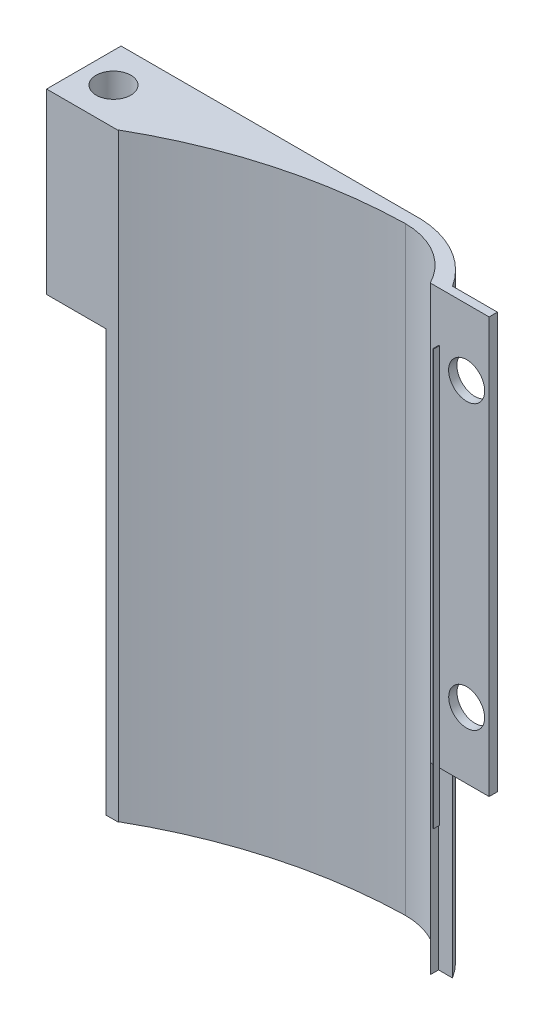
ISO-10303-21;
HEADER;
FILE_DESCRIPTION(('STEP AP214'),'2;1');
FILE_NAME('part.step','',(''),(''),'','','');
FILE_SCHEMA(('AUTOMOTIVE_DESIGN { 1 0 10303 214 1 1 1 1 }'));
ENDSEC;
DATA;
#1=APPLICATION_CONTEXT('core data for automotive mechanical design processes');
#2=APPLICATION_PROTOCOL_DEFINITION('international standard','automotive_design',2000,#1);
#3=PRODUCT_CONTEXT('',#1,'mechanical');
#4=PRODUCT('Part','Part','',(#3));
#5=PRODUCT_RELATED_PRODUCT_CATEGORY('part','',(#4));
#6=PRODUCT_DEFINITION_FORMATION('','',#4);
#7=PRODUCT_DEFINITION_CONTEXT('part definition',#1,'design');
#8=PRODUCT_DEFINITION('design','',#6,#7);
#9=PRODUCT_DEFINITION_SHAPE('','',#8);
#10=(LENGTH_UNIT() NAMED_UNIT(*) SI_UNIT(.MILLI.,.METRE.));
#11=(NAMED_UNIT(*) PLANE_ANGLE_UNIT() SI_UNIT($,.RADIAN.));
#12=(NAMED_UNIT(*) SI_UNIT($,.STERADIAN.) SOLID_ANGLE_UNIT());
#13=UNCERTAINTY_MEASURE_WITH_UNIT(LENGTH_MEASURE(1.E-05),#10,'distance_accuracy_value','');
#14=(GEOMETRIC_REPRESENTATION_CONTEXT(3) GLOBAL_UNCERTAINTY_ASSIGNED_CONTEXT((#13)) GLOBAL_UNIT_ASSIGNED_CONTEXT((#10,
#11,#12)) REPRESENTATION_CONTEXT('',''));
#15=CARTESIAN_POINT('',(0.,0.,0.));
#16=DIRECTION('',(0.,0.,1.));
#17=DIRECTION('',(1.,0.,0.));
#18=AXIS2_PLACEMENT_3D('',#15,#16,#17);
#19=CARTESIAN_POINT('',(0.,-1.27,0.));
#20=DIRECTION('',(0.,-1.,0.));
#21=DIRECTION('',(0.,0.,-1.));
#22=AXIS2_PLACEMENT_3D('',#19,#20,#21);
#23=PLANE('',#22);
#24=DIRECTION('',(1.,0.,0.));
#25=VECTOR('',#24,1.);
#26=CARTESIAN_POINT('',(0.,-1.27,0.));
#27=LINE('',#26,#25);
#28=CARTESIAN_POINT('',(0.,-1.27,0.));
#29=VERTEX_POINT('',#28);
#30=CARTESIAN_POINT('',(51.5910283033738,-1.27,0.));
#31=VERTEX_POINT('',#30);
#32=EDGE_CURVE('E168',#29,#31,#27,.T.);
#33=ORIENTED_EDGE('',*,*,#32,.T.);
#34=CARTESIAN_POINT('',(50.8036916723281,-1.27,19.5581227988323));
#35=DIRECTION('',(0.,-1.,0.));
#36=DIRECTION('',(0.,0.,-1.));
#37=AXIS2_PLACEMENT_3D('',#34,#35,#36);
#38=CIRCLE('',#37,19.5739639926304);
#39=CARTESIAN_POINT('',(67.3209218886942,-1.27,9.05473418542025));
#40=VERTEX_POINT('',#39);
#41=EDGE_CURVE('E402',#31,#40,#38,.T.);
#42=ORIENTED_EDGE('',*,*,#41,.T.);
#43=DIRECTION('',(1.,0.,0.));
#44=VECTOR('',#43,1.);
#45=CARTESIAN_POINT('',(0.,-1.27,9.05473418542025));
#46=LINE('',#45,#44);
#47=CARTESIAN_POINT('',(64.3381503709442,-1.27,9.05473418542025));
#48=VERTEX_POINT('',#47);
#49=EDGE_CURVE('E202',#48,#40,#46,.T.);
#50=ORIENTED_EDGE('',*,*,#49,.F.);
#51=DIRECTION('',(0.,0.,-1.));
#52=VECTOR('',#51,1.);
#53=CARTESIAN_POINT('',(64.3381503709442,-1.27,0.));
#54=LINE('',#53,#52);
#55=CARTESIAN_POINT('',(64.3381503709442,-1.27,10.8325949342759));
#56=VERTEX_POINT('',#55);
#57=EDGE_CURVE('E207',#56,#48,#54,.T.);
#58=ORIENTED_EDGE('',*,*,#57,.F.);
#59=CARTESIAN_POINT('',(50.6630504580124,-1.27,17.8690638416022));
#60=DIRECTION('',(0.,-1.,0.));
#61=DIRECTION('',(0.,0.,-1.));
#62=AXIS2_PLACEMENT_3D('',#59,#60,#61);
#63=CIRCLE('',#62,15.3792149446075);
#64=CARTESIAN_POINT('',(50.6454557752537,-1.27,2.48985896164905));
#65=VERTEX_POINT('',#64);
#66=EDGE_CURVE('E186',#56,#65,#63,.F.);
#67=ORIENTED_EDGE('',*,*,#66,.T.);
#68=CARTESIAN_POINT('',(52.877935396451,-1.27,103.644421254378));
#69=DIRECTION('',(0.,-1.,0.));
#70=DIRECTION('',(0.,0.,-1.));
#71=AXIS2_PLACEMENT_3D('',#68,#69,#70);
#72=CIRCLE('',#71,101.179194688891);
#73=CARTESIAN_POINT('',(2.54599808800984,-1.27,15.8724124778222));
#74=VERTEX_POINT('',#73);
#75=EDGE_CURVE('E182',#65,#74,#72,.F.);
#76=ORIENTED_EDGE('',*,*,#75,.T.);
#77=CARTESIAN_POINT('',(46.6879394543,-1.27,-50.0261717228403));
#78=DIRECTION('',(0.,-1.,0.));
#79=DIRECTION('',(0.,0.,-1.));
#80=AXIS2_PLACEMENT_3D('',#77,#78,#79);
#81=CIRCLE('',#80,79.3166715592428);
#82=CARTESIAN_POINT('',(2.65680958741076,-1.27,15.9465043626569));
#83=VERTEX_POINT('',#82);
#84=EDGE_CURVE('E179',#83,#74,#81,.T.);
#85=ORIENTED_EDGE('',*,*,#84,.F.);
#86=DIRECTION('',(-1.,0.,0.));
#87=VECTOR('',#86,1.);
#88=CARTESIAN_POINT('',(0.,-1.27,15.9465043626569));
#89=LINE('',#88,#87);
#90=CARTESIAN_POINT('',(0.,-1.27,15.9465043626569));
#91=VERTEX_POINT('',#90);
#92=EDGE_CURVE('E83',#83,#91,#89,.T.);
#93=ORIENTED_EDGE('',*,*,#92,.T.);
#94=DIRECTION('',(0.,0.,1.));
#95=VECTOR('',#94,1.);
#96=CARTESIAN_POINT('',(0.,-1.27,0.));
#97=LINE('',#96,#95);
#98=EDGE_CURVE('E158',#29,#91,#97,.T.);
#99=ORIENTED_EDGE('',*,*,#98,.F.);
#100=EDGE_LOOP('',(#33,#42,#50,#58,#67,#76,#85,#93,#99));
#101=FACE_BOUND('',#100,.T.);
#102=ADVANCED_FACE('F43',(#101),#23,.T.);
#103=CARTESIAN_POINT('',(0.,127.,0.));
#104=DIRECTION('',(0.,-1.,0.));
#105=DIRECTION('',(0.,0.,-1.));
#106=AXIS2_PLACEMENT_3D('',#103,#104,#105);
#107=PLANE('',#106);
#108=CARTESIAN_POINT('',(-6.23892880229527,127.,8.07492779839114));
#109=DIRECTION('',(0.,1.,0.));
#110=DIRECTION('',(0.,0.,1.));
#111=AXIS2_PLACEMENT_3D('',#108,#109,#110);
#112=CIRCLE('',#111,3.71302535466146);
#113=CARTESIAN_POINT('',(-6.23892880229527,127.,11.7879531530526));
#114=VERTEX_POINT('',#113);
#115=EDGE_CURVE('E174',#114,#114,#112,.T.);
#116=ORIENTED_EDGE('',*,*,#115,.F.);
#117=EDGE_LOOP('',(#116));
#118=FACE_BOUND('',#117,.T.);
#119=CARTESIAN_POINT('',(50.8036916723281,127.,19.5581227988323));
#120=DIRECTION('',(0.,1.,0.));
#121=DIRECTION('',(0.,0.,1.));
#122=AXIS2_PLACEMENT_3D('',#119,#120,#121);
#123=CIRCLE('',#122,19.5739639926304);
#124=CARTESIAN_POINT('',(67.3209218886942,127.,9.05473418542025));
#125=VERTEX_POINT('',#124);
#126=CARTESIAN_POINT('',(51.5910283033738,127.,0.));
#127=VERTEX_POINT('',#126);
#128=EDGE_CURVE('E279',#125,#127,#123,.T.);
#129=ORIENTED_EDGE('',*,*,#128,.T.);
#130=DIRECTION('',(1.,0.,0.));
#131=VECTOR('',#130,1.);
#132=CARTESIAN_POINT('',(0.,127.,0.));
#133=LINE('',#132,#131);
#134=CARTESIAN_POINT('',(-12.6918129546468,127.,0.));
#135=VERTEX_POINT('',#134);
#136=EDGE_CURVE('E178',#135,#127,#133,.T.);
#137=ORIENTED_EDGE('',*,*,#136,.F.);
#138=DIRECTION('',(0.,0.,1.));
#139=VECTOR('',#138,1.);
#140=CARTESIAN_POINT('',(-12.6918129546468,127.,0.));
#141=LINE('',#140,#139);
#142=CARTESIAN_POINT('',(-12.6918129546468,127.,15.9465043626569));
#143=VERTEX_POINT('',#142);
#144=EDGE_CURVE('E231',#135,#143,#141,.T.);
#145=ORIENTED_EDGE('',*,*,#144,.T.);
#146=DIRECTION('',(1.,0.,0.));
#147=VECTOR('',#146,1.);
#148=CARTESIAN_POINT('',(-12.6918129546468,127.,15.9465043626569));
#149=LINE('',#148,#147);
#150=CARTESIAN_POINT('',(2.65680958741079,127.,15.9465043626569));
#151=VERTEX_POINT('',#150);
#152=EDGE_CURVE('E185',#143,#151,#149,.T.);
#153=ORIENTED_EDGE('',*,*,#152,.T.);
#154=CARTESIAN_POINT('',(46.6879394543,127.,-50.0261717228403));
#155=DIRECTION('',(0.,1.,0.));
#156=DIRECTION('',(0.,0.,1.));
#157=AXIS2_PLACEMENT_3D('',#154,#155,#156);
#158=CIRCLE('',#157,79.3166715592428);
#159=CARTESIAN_POINT('',(2.54599808800984,127.,15.8724124778222));
#160=VERTEX_POINT('',#159);
#161=EDGE_CURVE('E191',#160,#151,#158,.T.);
#162=ORIENTED_EDGE('',*,*,#161,.F.);
#163=CARTESIAN_POINT('',(52.877935396451,127.,103.644421254378));
#164=DIRECTION('',(0.,1.,0.));
#165=DIRECTION('',(0.,0.,1.));
#166=AXIS2_PLACEMENT_3D('',#163,#164,#165);
#167=CIRCLE('',#166,101.179194688891);
#168=CARTESIAN_POINT('',(50.6454557752537,127.,2.48985896164906));
#169=VERTEX_POINT('',#168);
#170=EDGE_CURVE('E195',#160,#169,#167,.F.);
#171=ORIENTED_EDGE('',*,*,#170,.T.);
#172=CARTESIAN_POINT('',(50.6630504580124,127.,17.8690638416022));
#173=DIRECTION('',(0.,1.,0.));
#174=DIRECTION('',(0.,0.,1.));
#175=AXIS2_PLACEMENT_3D('',#172,#173,#174);
#176=CIRCLE('',#175,15.3792149446075);
#177=CARTESIAN_POINT('',(64.3381503709442,127.,10.8325949342759));
#178=VERTEX_POINT('',#177);
#179=EDGE_CURVE('E198',#169,#178,#176,.F.);
#180=ORIENTED_EDGE('',*,*,#179,.T.);
#181=DIRECTION('',(1.,0.,0.));
#182=VECTOR('',#181,1.);
#183=CARTESIAN_POINT('',(64.3381503709442,127.,10.8325949342759));
#184=LINE('',#183,#182);
#185=CARTESIAN_POINT('',(76.9364157085673,127.,10.8325949342759));
#186=VERTEX_POINT('',#185);
#187=EDGE_CURVE('E201',#178,#186,#184,.T.);
#188=ORIENTED_EDGE('',*,*,#187,.T.);
#189=DIRECTION('',(0.,0.,-1.));
#190=VECTOR('',#189,1.);
#191=CARTESIAN_POINT('',(76.9364157085673,127.,10.8325949342759));
#192=LINE('',#191,#190);
#193=CARTESIAN_POINT('',(76.9364157085673,127.,9.05473418542025));
#194=VERTEX_POINT('',#193);
#195=EDGE_CURVE('E223',#186,#194,#192,.T.);
#196=ORIENTED_EDGE('',*,*,#195,.T.);
#197=DIRECTION('',(-1.,0.,0.));
#198=VECTOR('',#197,1.);
#199=CARTESIAN_POINT('',(76.9364157085673,127.,9.05473418542025));
#200=LINE('',#199,#198);
#201=EDGE_CURVE('E226',#194,#125,#200,.T.);
#202=ORIENTED_EDGE('',*,*,#201,.T.);
#203=EDGE_LOOP('',(#129,#137,#145,#153,#162,#171,#180,#188,#196,#202));
#204=FACE_BOUND('',#203,.T.);
#205=ADVANCED_FACE('F45',(#118,#204),#107,.F.);
#206=CARTESIAN_POINT('',(0.,-1.27,0.));
#207=DIRECTION('',(0.,0.,1.));
#208=DIRECTION('',(1.,0.,0.));
#209=AXIS2_PLACEMENT_3D('',#206,#207,#208);
#210=PLANE('',#209);
#211=DIRECTION('',(0.,1.,0.));
#212=VECTOR('',#211,1.);
#213=CARTESIAN_POINT('',(51.5910283033738,-5.07999999999992,0.));
#214=LINE('',#213,#212);
#215=EDGE_CURVE('E326',#31,#127,#214,.T.);
#216=ORIENTED_EDGE('',*,*,#215,.F.);
#217=ORIENTED_EDGE('',*,*,#32,.F.);
#218=DIRECTION('',(0.,1.,0.));
#219=VECTOR('',#218,1.);
#220=CARTESIAN_POINT('',(0.,-1.27,0.));
#221=LINE('',#220,#219);
#222=CARTESIAN_POINT('',(0.,88.8999999999998,0.));
#223=VERTEX_POINT('',#222);
#224=EDGE_CURVE('E212',#29,#223,#221,.T.);
#225=ORIENTED_EDGE('',*,*,#224,.T.);
#226=DIRECTION('',(-1.,0.,0.));
#227=VECTOR('',#226,1.);
#228=CARTESIAN_POINT('',(0.,88.8999999999998,0.));
#229=LINE('',#228,#227);
#230=CARTESIAN_POINT('',(-12.6918129546468,88.8999999999998,0.));
#231=VERTEX_POINT('',#230);
#232=EDGE_CURVE('E172',#223,#231,#229,.T.);
#233=ORIENTED_EDGE('',*,*,#232,.T.);
#234=DIRECTION('',(0.,1.,0.));
#235=VECTOR('',#234,1.);
#236=CARTESIAN_POINT('',(-12.6918129546468,88.8999999999998,0.));
#237=LINE('',#236,#235);
#238=EDGE_CURVE('E314',#231,#135,#237,.T.);
#239=ORIENTED_EDGE('',*,*,#238,.T.);
#240=ORIENTED_EDGE('',*,*,#136,.T.);
#241=EDGE_LOOP('',(#216,#217,#225,#233,#239,#240));
#242=FACE_BOUND('',#241,.T.);
#243=ADVANCED_FACE('F324',(#242),#210,.F.);
#244=CARTESIAN_POINT('',(-6.23892880229527,54.1019999999999,8.07492779839114));
#245=DIRECTION('',(0.,1.,0.));
#246=DIRECTION('',(0.,0.,1.));
#247=AXIS2_PLACEMENT_3D('',#244,#245,#246);
#248=CYLINDRICAL_SURFACE('',#247,3.71302535466146);
#249=CARTESIAN_POINT('',(-6.23892880229527,91.4399999999999,8.07492779839114));
#250=DIRECTION('',(0.,-1.,0.));
#251=DIRECTION('',(0.,0.,-1.));
#252=AXIS2_PLACEMENT_3D('',#249,#250,#251);
#253=CIRCLE('',#252,3.71302535466146);
#254=CARTESIAN_POINT('',(-6.23892880229527,91.4399999999999,11.7879531530526));
#255=VERTEX_POINT('',#254);
#256=EDGE_CURVE('E47',#255,#255,#253,.F.);
#257=CARTESIAN_POINT('',(-6.23892880229527,127.,11.7879531530526));
#258=CARTESIAN_POINT('',(-6.23892880229527,126.629583333333,11.7879531530526));
#259=CARTESIAN_POINT('',(-6.23892880229527,126.259166666667,11.7879531530526));
#260=CARTESIAN_POINT('',(-6.23892880229527,125.518333333333,11.7879531530526));
#261=CARTESIAN_POINT('',(-6.23892880229527,125.147916666667,11.7879531530526));
#262=CARTESIAN_POINT('',(-6.23892880229527,124.407083333333,11.7879531530526));
#263=CARTESIAN_POINT('',(-6.23892880229527,124.036666666667,11.7879531530526));
#264=CARTESIAN_POINT('',(-6.23892880229527,123.295833333333,11.7879531530526));
#265=CARTESIAN_POINT('',(-6.23892880229527,122.925416666667,11.7879531530526));
#266=CARTESIAN_POINT('',(-6.23892880229527,122.184583333333,11.7879531530526));
#267=CARTESIAN_POINT('',(-6.23892880229527,121.814166666667,11.7879531530526));
#268=CARTESIAN_POINT('',(-6.23892880229527,121.073333333333,11.7879531530526));
#269=CARTESIAN_POINT('',(-6.23892880229527,120.702916666667,11.7879531530526));
#270=CARTESIAN_POINT('',(-6.23892880229527,119.962083333333,11.7879531530526));
#271=CARTESIAN_POINT('',(-6.23892880229527,119.591666666667,11.7879531530526));
#272=CARTESIAN_POINT('',(-6.23892880229527,118.850833333333,11.7879531530526));
#273=CARTESIAN_POINT('',(-6.23892880229527,118.480416666667,11.7879531530526));
#274=CARTESIAN_POINT('',(-6.23892880229527,117.739583333333,11.7879531530526));
#275=CARTESIAN_POINT('',(-6.23892880229527,117.369166666667,11.7879531530526));
#276=CARTESIAN_POINT('',(-6.23892880229527,116.628333333333,11.7879531530526));
#277=CARTESIAN_POINT('',(-6.23892880229527,116.257916666667,11.7879531530526));
#278=CARTESIAN_POINT('',(-6.23892880229527,115.517083333333,11.7879531530526));
#279=CARTESIAN_POINT('',(-6.23892880229527,115.146666666667,11.7879531530526));
#280=CARTESIAN_POINT('',(-6.23892880229527,114.405833333333,11.7879531530526));
#281=CARTESIAN_POINT('',(-6.23892880229527,114.035416666667,11.7879531530526));
#282=CARTESIAN_POINT('',(-6.23892880229527,113.294583333333,11.7879531530526));
#283=CARTESIAN_POINT('',(-6.23892880229527,112.924166666667,11.7879531530526));
#284=CARTESIAN_POINT('',(-6.23892880229527,112.183333333333,11.7879531530526));
#285=CARTESIAN_POINT('',(-6.23892880229527,111.812916666667,11.7879531530526));
#286=CARTESIAN_POINT('',(-6.23892880229527,111.072083333333,11.7879531530526));
#287=CARTESIAN_POINT('',(-6.23892880229527,110.701666666667,11.7879531530526));
#288=CARTESIAN_POINT('',(-6.23892880229527,109.960833333333,11.7879531530526));
#289=CARTESIAN_POINT('',(-6.23892880229527,109.590416666667,11.7879531530526));
#290=CARTESIAN_POINT('',(-6.23892880229527,108.849583333333,11.7879531530526));
#291=CARTESIAN_POINT('',(-6.23892880229527,108.479166666667,11.7879531530526));
#292=CARTESIAN_POINT('',(-6.23892880229527,107.738333333333,11.7879531530526));
#293=CARTESIAN_POINT('',(-6.23892880229527,107.367916666667,11.7879531530526));
#294=CARTESIAN_POINT('',(-6.23892880229527,106.627083333333,11.7879531530526));
#295=CARTESIAN_POINT('',(-6.23892880229527,106.256666666667,11.7879531530526));
#296=CARTESIAN_POINT('',(-6.23892880229527,105.515833333333,11.7879531530526));
#297=CARTESIAN_POINT('',(-6.23892880229527,105.145416666667,11.7879531530526));
#298=CARTESIAN_POINT('',(-6.23892880229527,104.404583333333,11.7879531530526));
#299=CARTESIAN_POINT('',(-6.23892880229527,104.034166666667,11.7879531530526));
#300=CARTESIAN_POINT('',(-6.23892880229527,103.293333333333,11.7879531530526));
#301=CARTESIAN_POINT('',(-6.23892880229527,102.922916666667,11.7879531530526));
#302=CARTESIAN_POINT('',(-6.23892880229527,102.182083333333,11.7879531530526));
#303=CARTESIAN_POINT('',(-6.23892880229527,101.811666666667,11.7879531530526));
#304=CARTESIAN_POINT('',(-6.23892880229527,101.070833333333,11.7879531530526));
#305=CARTESIAN_POINT('',(-6.23892880229527,100.700416666667,11.7879531530526));
#306=CARTESIAN_POINT('',(-6.23892880229527,99.9595833333332,11.7879531530526));
#307=CARTESIAN_POINT('',(-6.23892880229527,99.5891666666666,11.7879531530526));
#308=CARTESIAN_POINT('',(-6.23892880229527,98.8483333333332,11.7879531530526));
#309=CARTESIAN_POINT('',(-6.23892880229527,98.4779166666666,11.7879531530526));
#310=CARTESIAN_POINT('',(-6.23892880229527,97.7370833333332,11.7879531530526));
#311=CARTESIAN_POINT('',(-6.23892880229527,97.3666666666666,11.7879531530526));
#312=CARTESIAN_POINT('',(-6.23892880229527,96.6258333333332,11.7879531530526));
#313=CARTESIAN_POINT('',(-6.23892880229527,96.2554166666665,11.7879531530526));
#314=CARTESIAN_POINT('',(-6.23892880229527,95.5145833333332,11.7879531530526));
#315=CARTESIAN_POINT('',(-6.23892880229527,95.1441666666665,11.7879531530526));
#316=CARTESIAN_POINT('',(-6.23892880229527,94.4033333333332,11.7879531530526));
#317=CARTESIAN_POINT('',(-6.23892880229527,94.0329166666665,11.7879531530526));
#318=CARTESIAN_POINT('',(-6.23892880229527,93.2920833333332,11.7879531530526));
#319=CARTESIAN_POINT('',(-6.23892880229527,92.9216666666665,11.7879531530526));
#320=CARTESIAN_POINT('',(-6.23892880229527,92.1808333333332,11.7879531530526));
#321=CARTESIAN_POINT('',(-6.23892880229527,91.8104166666665,11.7879531530526));
#322=CARTESIAN_POINT('',(-6.23892880229527,91.4399999999999,11.7879531530526));
#323=B_SPLINE_CURVE_WITH_KNOTS('',3,(#257,#258,#259,#260,#261,#262,#263,#264,#265,#266,#267,
#268,#269,#270,#271,#272,#273,#274,#275,#276,#277,#278,#279,#280,#281,#282,#283,#284,#285,#286,
#287,#288,#289,#290,#291,#292,#293,#294,#295,#296,#297,#298,#299,#300,#301,#302,#303,#304,#305,
#306,#307,#308,#309,#310,#311,#312,#313,#314,#315,#316,#317,#318,#319,#320,#321,#322),
.UNSPECIFIED.,.F.,.F.,(4,2,2,2,2,2,2,2,2,2,2,2,2,2,2,2,2,2,2,2,2,2,2,2,2,2,2,2,2,2,2,2,4),(0.,
1.11125000000001,2.2225,3.33375,4.445,5.55625000000001,6.66750000000002,7.77875000000001,
8.89000000000002,10.00125,11.1125,12.22375,13.335,14.44625,15.5575000000001,16.6687500000001,
17.7800000000001,18.8912500000001,20.0025000000001,21.1137500000001,22.2250000000001,
23.3362500000001,24.4475000000001,25.5587500000001,26.6700000000001,27.7812500000001,
28.8925000000001,30.0037500000001,31.1150000000001,32.2262500000001,33.3375000000001,
34.4487500000001,35.5600000000001),.UNSPECIFIED.);
#324=EDGE_CURVE('BSEAM354',#114,#255,#323,.T.);
#325=ORIENTED_EDGE('',*,*,#115,.T.);
#326=ORIENTED_EDGE('',*,*,#256,.F.);
#327=ORIENTED_EDGE('',*,*,#324,.T.);
#328=ORIENTED_EDGE('',*,*,#324,.F.);
#329=EDGE_LOOP('',(#325,#327,#326,#328));
#330=FACE_BOUND('',#329,.T.);
#331=ADVANCED_FACE('F354',(#330),#248,.F.);
#332=CARTESIAN_POINT('',(0.,-1.27,0.));
#333=DIRECTION('',(-1.,0.,0.));
#334=DIRECTION('',(0.,0.,1.));
#335=AXIS2_PLACEMENT_3D('',#332,#333,#334);
#336=PLANE('',#335);
#337=ORIENTED_EDGE('',*,*,#98,.T.);
#338=DIRECTION('',(0.,1.,0.));
#339=VECTOR('',#338,1.);
#340=CARTESIAN_POINT('',(0.,-1.27,15.9465043626569));
#341=LINE('',#340,#339);
#342=CARTESIAN_POINT('',(0.,88.8999999999998,15.9465043626569));
#343=VERTEX_POINT('',#342);
#344=EDGE_CURVE('E145',#91,#343,#341,.T.);
#345=ORIENTED_EDGE('',*,*,#344,.T.);
#346=DIRECTION('',(0.,0.,-1.));
#347=VECTOR('',#346,1.);
#348=CARTESIAN_POINT('',(0.,88.8999999999998,31.7448249556444));
#349=LINE('',#348,#347);
#350=CARTESIAN_POINT('',(0.,88.8999999999998,8.07492779839112));
#351=VERTEX_POINT('',#350);
#352=EDGE_CURVE('E156',#343,#351,#349,.T.);
#353=ORIENTED_EDGE('',*,*,#352,.T.);
#354=EDGE_CURVE('E159',#351,#223,#349,.T.);
#355=ORIENTED_EDGE('',*,*,#354,.T.);
#356=ORIENTED_EDGE('',*,*,#224,.F.);
#357=EDGE_LOOP('',(#337,#345,#353,#355,#356));
#358=FACE_BOUND('',#357,.T.);
#359=ADVANCED_FACE('F155',(#358),#336,.T.);
#360=CARTESIAN_POINT('',(-12.6918129546468,88.8999999999998,0.));
#361=DIRECTION('',(-1.,0.,0.));
#362=DIRECTION('',(0.,0.,1.));
#363=AXIS2_PLACEMENT_3D('',#360,#361,#362);
#364=PLANE('',#363);
#365=DIRECTION('',(0.,0.,1.));
#366=VECTOR('',#365,1.);
#367=CARTESIAN_POINT('',(-12.6918129546468,88.8999999999998,0.));
#368=LINE('',#367,#366);
#369=CARTESIAN_POINT('',(-12.6918129546468,88.8999999999998,15.9465043626569));
#370=VERTEX_POINT('',#369);
#371=EDGE_CURVE('E251',#231,#370,#368,.T.);
#372=ORIENTED_EDGE('',*,*,#371,.T.);
#373=DIRECTION('',(0.,1.,0.));
#374=VECTOR('',#373,1.);
#375=CARTESIAN_POINT('',(-12.6918129546468,-11.176,15.9465043626569));
#376=LINE('',#375,#374);
#377=EDGE_CURVE('E69',#370,#143,#376,.T.);
#378=ORIENTED_EDGE('',*,*,#377,.T.);
#379=ORIENTED_EDGE('',*,*,#144,.F.);
#380=ORIENTED_EDGE('',*,*,#238,.F.);
#381=EDGE_LOOP('',(#372,#378,#379,#380));
#382=FACE_BOUND('',#381,.T.);
#383=ADVANCED_FACE('F318',(#382),#364,.T.);
#384=CARTESIAN_POINT('',(0.,88.8999999999998,0.));
#385=DIRECTION('',(0.,1.,0.));
#386=DIRECTION('',(0.,0.,1.));
#387=AXIS2_PLACEMENT_3D('',#384,#385,#386);
#388=PLANE('',#387);
#389=ORIENTED_EDGE('',*,*,#354,.F.);
#390=DIRECTION('',(0.499999999999995,0.,0.866025403784442));
#391=VECTOR('',#390,1.);
#392=CARTESIAN_POINT('',(-3.11946440114757,88.8999999999998,2.67185696320105));
#393=LINE('',#392,#391);
#394=CARTESIAN_POINT('',(-3.11946440114757,88.8999999999998,2.67185696320105));
#395=VERTEX_POINT('',#394);
#396=EDGE_CURVE('E60',#395,#351,#393,.T.);
#397=ORIENTED_EDGE('',*,*,#396,.F.);
#398=DIRECTION('',(1.,0.,0.));
#399=VECTOR('',#398,1.);
#400=CARTESIAN_POINT('',(-9.35839320344285,88.8999999999998,2.67185696320098));
#401=LINE('',#400,#399);
#402=CARTESIAN_POINT('',(-9.35839320344285,88.8999999999998,2.67185696320098));
#403=VERTEX_POINT('',#402);
#404=EDGE_CURVE('E376',#403,#395,#401,.T.);
#405=ORIENTED_EDGE('',*,*,#404,.F.);
#406=DIRECTION('',(0.500000000000007,0.,-0.866025403784435));
#407=VECTOR('',#406,1.);
#408=CARTESIAN_POINT('',(-12.4778576045905,88.8999999999998,8.07492779839109));
#409=LINE('',#408,#407);
#410=CARTESIAN_POINT('',(-12.4778576045905,88.8999999999998,8.07492779839109));
#411=VERTEX_POINT('',#410);
#412=EDGE_CURVE('E409',#411,#403,#409,.T.);
#413=ORIENTED_EDGE('',*,*,#412,.F.);
#414=DIRECTION('',(-0.499999999999995,0.,-0.866025403784442));
#415=VECTOR('',#414,1.);
#416=CARTESIAN_POINT('',(-9.35839320344293,88.8999999999998,13.4779986335812));
#417=LINE('',#416,#415);
#418=CARTESIAN_POINT('',(-9.35839320344293,88.8999999999998,13.4779986335812));
#419=VERTEX_POINT('',#418);
#420=EDGE_CURVE('E407',#419,#411,#417,.T.);
#421=ORIENTED_EDGE('',*,*,#420,.F.);
#422=DIRECTION('',(-1.,0.,0.));
#423=VECTOR('',#422,1.);
#424=CARTESIAN_POINT('',(-3.11946440114765,88.8999999999998,13.4779986335813));
#425=LINE('',#424,#423);
#426=CARTESIAN_POINT('',(-3.11946440114765,88.8999999999998,13.4779986335813));
#427=VERTEX_POINT('',#426);
#428=EDGE_CURVE('E404',#427,#419,#425,.T.);
#429=ORIENTED_EDGE('',*,*,#428,.F.);
#430=DIRECTION('',(-0.500000000000001,0.,0.866025403784438));
#431=VECTOR('',#430,1.);
#432=CARTESIAN_POINT('',(0.,88.8999999999998,8.07492779839114));
#433=LINE('',#432,#431);
#434=EDGE_CURVE('E166',#351,#427,#433,.T.);
#435=ORIENTED_EDGE('',*,*,#434,.F.);
#436=ORIENTED_EDGE('',*,*,#352,.F.);
#437=DIRECTION('',(1.,0.,0.));
#438=VECTOR('',#437,1.);
#439=CARTESIAN_POINT('',(0.,88.8999999999998,15.9465043626569));
#440=LINE('',#439,#438);
#441=EDGE_CURVE('E52',#370,#343,#440,.T.);
#442=ORIENTED_EDGE('',*,*,#441,.F.);
#443=ORIENTED_EDGE('',*,*,#371,.F.);
#444=ORIENTED_EDGE('',*,*,#232,.F.);
#445=EDGE_LOOP('',(#389,#397,#405,#413,#421,#429,#435,#436,#442,#443,#444));
#446=FACE_BOUND('',#445,.T.);
#447=ADVANCED_FACE('F163',(#446),#388,.F.);
#448=CARTESIAN_POINT('',(46.6879394543,-50.8,-50.0261717228403));
#449=DIRECTION('',(0.,1.,0.));
#450=DIRECTION('',(0.,0.,1.));
#451=AXIS2_PLACEMENT_3D('',#448,#449,#450);
#452=CYLINDRICAL_SURFACE('',#451,79.3166715592428);
#453=DIRECTION('',(0.,1.,0.));
#454=VECTOR('',#453,1.);
#455=CARTESIAN_POINT('',(2.65680958741076,-50.8,15.9465043626569));
#456=LINE('',#455,#454);
#457=EDGE_CURVE('E12',#83,#151,#456,.T.);
#458=ORIENTED_EDGE('',*,*,#457,.F.);
#459=ORIENTED_EDGE('',*,*,#84,.T.);
#460=DIRECTION('',(0.,1.,0.));
#461=VECTOR('',#460,1.);
#462=CARTESIAN_POINT('',(2.54599808800984,-50.8,15.8724124778222));
#463=LINE('',#462,#461);
#464=EDGE_CURVE('E181',#74,#160,#463,.T.);
#465=ORIENTED_EDGE('',*,*,#464,.T.);
#466=ORIENTED_EDGE('',*,*,#161,.T.);
#467=EDGE_LOOP('',(#458,#459,#465,#466));
#468=FACE_BOUND('',#467,.T.);
#469=ADVANCED_FACE('F258',(#468),#452,.F.);
#470=CARTESIAN_POINT('',(64.3381503709442,-13.7526569996032,15.8724124778222));
#471=DIRECTION('',(-1.,0.,0.));
#472=DIRECTION('',(0.,0.,1.));
#473=AXIS2_PLACEMENT_3D('',#470,#471,#472);
#474=PLANE('',#473);
#475=DIRECTION('',(0.,0.,1.));
#476=VECTOR('',#475,1.);
#477=CARTESIAN_POINT('',(64.3381503709442,38.0633430003968,9.05473418542025));
#478=LINE('',#477,#476);
#479=CARTESIAN_POINT('',(64.3381503709442,38.0633430003968,9.05473418542025));
#480=VERTEX_POINT('',#479);
#481=CARTESIAN_POINT('',(64.3381503709442,38.0633430003968,10.8325949342759));
#482=VERTEX_POINT('',#481);
#483=EDGE_CURVE('E194',#480,#482,#478,.T.);
#484=ORIENTED_EDGE('',*,*,#483,.T.);
#485=DIRECTION('',(0.,1.,0.));
#486=VECTOR('',#485,1.);
#487=CARTESIAN_POINT('',(64.3381503709442,-50.8,10.8325949342759));
#488=LINE('',#487,#486);
#489=EDGE_CURVE('E209',#482,#56,#488,.F.);
#490=ORIENTED_EDGE('',*,*,#489,.T.);
#491=ORIENTED_EDGE('',*,*,#57,.T.);
#492=DIRECTION('',(0.,1.,0.));
#493=VECTOR('',#492,1.);
#494=CARTESIAN_POINT('',(64.3381503709442,-13.7526569996032,9.05473418542025));
#495=LINE('',#494,#493);
#496=EDGE_CURVE('E206',#48,#480,#495,.T.);
#497=ORIENTED_EDGE('',*,*,#496,.T.);
#498=EDGE_LOOP('',(#484,#490,#491,#497));
#499=FACE_BOUND('',#498,.T.);
#500=ADVANCED_FACE('F535',(#499),#474,.F.);
#501=CARTESIAN_POINT('',(67.3209218886942,-13.7526569996032,9.05473418542025));
#502=DIRECTION('',(0.,0.,-1.));
#503=DIRECTION('',(-1.,0.,0.));
#504=AXIS2_PLACEMENT_3D('',#501,#502,#503);
#505=PLANE('',#504);
#506=DIRECTION('',(1.,0.,0.));
#507=VECTOR('',#506,1.);
#508=CARTESIAN_POINT('',(67.3209218886942,38.0633430003968,9.05473418542025));
#509=LINE('',#508,#507);
#510=CARTESIAN_POINT('',(67.3209218886942,38.0633430003968,9.05473418542025));
#511=VERTEX_POINT('',#510);
#512=EDGE_CURVE('E217',#480,#511,#509,.T.);
#513=ORIENTED_EDGE('',*,*,#512,.F.);
#514=ORIENTED_EDGE('',*,*,#496,.F.);
#515=ORIENTED_EDGE('',*,*,#49,.T.);
#516=DIRECTION('',(0.,1.,0.));
#517=VECTOR('',#516,1.);
#518=CARTESIAN_POINT('',(67.3209218886942,-13.7526569996032,9.05473418542025));
#519=LINE('',#518,#517);
#520=EDGE_CURVE('E205',#40,#511,#519,.T.);
#521=ORIENTED_EDGE('',*,*,#520,.T.);
#522=EDGE_LOOP('',(#513,#514,#515,#521));
#523=FACE_BOUND('',#522,.T.);
#524=ADVANCED_FACE('F298',(#523),#505,.F.);
#525=CARTESIAN_POINT('',(52.877935396451,-50.8,103.644421254378));
#526=DIRECTION('',(0.,1.,0.));
#527=DIRECTION('',(0.,0.,1.));
#528=AXIS2_PLACEMENT_3D('',#525,#526,#527);
#529=CYLINDRICAL_SURFACE('',#528,101.179194688891);
#530=DIRECTION('',(0.,1.,0.));
#531=VECTOR('',#530,1.);
#532=CARTESIAN_POINT('',(50.6454557752537,-50.8,2.48985896164906));
#533=LINE('',#532,#531);
#534=EDGE_CURVE('E177',#65,#169,#533,.T.);
#535=ORIENTED_EDGE('',*,*,#534,.T.);
#536=ORIENTED_EDGE('',*,*,#170,.F.);
#537=ORIENTED_EDGE('',*,*,#464,.F.);
#538=ORIENTED_EDGE('',*,*,#75,.F.);
#539=EDGE_LOOP('',(#535,#536,#537,#538));
#540=FACE_BOUND('',#539,.T.);
#541=ADVANCED_FACE('F264',(#540),#529,.F.);
#542=CARTESIAN_POINT('',(50.6630504580124,-50.8,17.8690638416022));
#543=DIRECTION('',(0.,1.,0.));
#544=DIRECTION('',(0.,0.,1.));
#545=AXIS2_PLACEMENT_3D('',#542,#543,#544);
#546=CYLINDRICAL_SURFACE('',#545,15.3792149446075);
#547=EDGE_CURVE('E221',#178,#482,#488,.F.);
#548=ORIENTED_EDGE('',*,*,#547,.F.);
#549=ORIENTED_EDGE('',*,*,#179,.F.);
#550=ORIENTED_EDGE('',*,*,#534,.F.);
#551=ORIENTED_EDGE('',*,*,#66,.F.);
#552=ORIENTED_EDGE('',*,*,#489,.F.);
#553=EDGE_LOOP('',(#548,#549,#550,#551,#552));
#554=FACE_BOUND('',#553,.T.);
#555=ADVANCED_FACE('F331',(#554),#546,.F.);
#556=CARTESIAN_POINT('',(76.9364157085673,38.0633430003968,9.05473418542025));
#557=DIRECTION('',(0.,0.,-1.));
#558=DIRECTION('',(-1.,0.,0.));
#559=AXIS2_PLACEMENT_3D('',#556,#557,#558);
#560=PLANE('',#559);
#561=CARTESIAN_POINT('',(72.1286687986307,52.1989503762012,9.05473418542025));
#562=DIRECTION('',(0.,0.,-1.));
#563=DIRECTION('',(-1.,0.,0.));
#564=AXIS2_PLACEMENT_3D('',#561,#562,#563);
#565=CIRCLE('',#564,3.84203339919073);
#566=CARTESIAN_POINT('',(68.28663539944,52.1989503762012,9.05473418542025));
#567=VERTEX_POINT('',#566);
#568=EDGE_CURVE('E150',#567,#567,#565,.T.);
#569=ORIENTED_EDGE('',*,*,#568,.F.);
#570=EDGE_LOOP('',(#569));
#571=FACE_BOUND('',#570,.T.);
#572=CARTESIAN_POINT('',(72.1286687986307,112.805210201177,9.05473418542025));
#573=DIRECTION('',(0.,0.,-1.));
#574=DIRECTION('',(-1.,0.,0.));
#575=AXIS2_PLACEMENT_3D('',#572,#573,#574);
#576=CIRCLE('',#575,3.86244353917928);
#577=CARTESIAN_POINT('',(68.2662252594514,112.805210201177,9.05473418542025));
#578=VERTEX_POINT('',#577);
#579=EDGE_CURVE('E243',#578,#578,#576,.T.);
#580=ORIENTED_EDGE('',*,*,#579,.F.);
#581=EDGE_LOOP('',(#580));
#582=FACE_BOUND('',#581,.T.);
#583=EDGE_CURVE('E189',#511,#125,#519,.T.);
#584=ORIENTED_EDGE('',*,*,#583,.T.);
#585=ORIENTED_EDGE('',*,*,#201,.F.);
#586=DIRECTION('',(0.,1.,0.));
#587=VECTOR('',#586,1.);
#588=CARTESIAN_POINT('',(76.9364157085673,38.0633430003968,9.05473418542025));
#589=LINE('',#588,#587);
#590=CARTESIAN_POINT('',(76.9364157085673,38.0633430003968,9.05473418542025));
#591=VERTEX_POINT('',#590);
#592=EDGE_CURVE('E219',#591,#194,#589,.T.);
#593=ORIENTED_EDGE('',*,*,#592,.F.);
#594=DIRECTION('',(-1.,0.,0.));
#595=VECTOR('',#594,1.);
#596=CARTESIAN_POINT('',(76.9364157085673,38.0633430003968,9.05473418542025));
#597=LINE('',#596,#595);
#598=EDGE_CURVE('E234',#591,#511,#597,.T.);
#599=ORIENTED_EDGE('',*,*,#598,.T.);
#600=EDGE_LOOP('',(#584,#585,#593,#599));
#601=FACE_BOUND('',#600,.T.);
#602=ADVANCED_FACE('F283',(#571,#582,#601),#560,.T.);
#603=CARTESIAN_POINT('',(76.9364157085673,38.0633430003968,10.8325949342759));
#604=DIRECTION('',(1.,0.,0.));
#605=DIRECTION('',(0.,0.,-1.));
#606=AXIS2_PLACEMENT_3D('',#603,#604,#605);
#607=PLANE('',#606);
#608=ORIENTED_EDGE('',*,*,#195,.F.);
#609=DIRECTION('',(0.,1.,0.));
#610=VECTOR('',#609,1.);
#611=CARTESIAN_POINT('',(76.9364157085673,38.0633430003968,10.8325949342759));
#612=LINE('',#611,#610);
#613=CARTESIAN_POINT('',(76.9364157085673,38.0633430003968,10.8325949342759));
#614=VERTEX_POINT('',#613);
#615=EDGE_CURVE('E215',#614,#186,#612,.T.);
#616=ORIENTED_EDGE('',*,*,#615,.F.);
#617=DIRECTION('',(0.,0.,-1.));
#618=VECTOR('',#617,1.);
#619=CARTESIAN_POINT('',(76.9364157085673,38.0633430003968,10.8325949342759));
#620=LINE('',#619,#618);
#621=EDGE_CURVE('E222',#614,#591,#620,.T.);
#622=ORIENTED_EDGE('',*,*,#621,.T.);
#623=ORIENTED_EDGE('',*,*,#592,.T.);
#624=EDGE_LOOP('',(#608,#616,#622,#623));
#625=FACE_BOUND('',#624,.T.);
#626=ADVANCED_FACE('F276',(#625),#607,.T.);
#627=CARTESIAN_POINT('',(64.3381503709442,38.0633430003968,10.8325949342759));
#628=DIRECTION('',(0.,0.,1.));
#629=DIRECTION('',(1.,0.,0.));
#630=AXIS2_PLACEMENT_3D('',#627,#628,#629);
#631=PLANE('',#630);
#632=CARTESIAN_POINT('',(72.1286687986307,52.1989503762012,10.8325949342759));
#633=DIRECTION('',(0.,0.,1.));
#634=DIRECTION('',(1.,0.,0.));
#635=AXIS2_PLACEMENT_3D('',#632,#633,#634);
#636=CIRCLE('',#635,3.84203339919073);
#637=CARTESIAN_POINT('',(75.9707021978215,52.1989503762012,10.8325949342759));
#638=VERTEX_POINT('',#637);
#639=EDGE_CURVE('E246',#638,#638,#636,.T.);
#640=ORIENTED_EDGE('',*,*,#639,.F.);
#641=EDGE_LOOP('',(#640));
#642=FACE_BOUND('',#641,.T.);
#643=CARTESIAN_POINT('',(72.1286687986307,112.805210201177,10.8325949342759));
#644=DIRECTION('',(0.,0.,1.));
#645=DIRECTION('',(1.,0.,0.));
#646=AXIS2_PLACEMENT_3D('',#643,#644,#645);
#647=CIRCLE('',#646,3.86244353917928);
#648=CARTESIAN_POINT('',(75.99111233781,112.805210201177,10.8325949342759));
#649=VERTEX_POINT('',#648);
#650=EDGE_CURVE('E240',#649,#649,#647,.T.);
#651=ORIENTED_EDGE('',*,*,#650,.F.);
#652=EDGE_LOOP('',(#651));
#653=FACE_BOUND('',#652,.T.);
#654=ORIENTED_EDGE('',*,*,#187,.F.);
#655=ORIENTED_EDGE('',*,*,#547,.T.);
#656=DIRECTION('',(1.,0.,0.));
#657=VECTOR('',#656,1.);
#658=CARTESIAN_POINT('',(64.3381503709442,38.0633430003968,10.8325949342759));
#659=LINE('',#658,#657);
#660=EDGE_CURVE('E218',#482,#614,#659,.T.);
#661=ORIENTED_EDGE('',*,*,#660,.T.);
#662=ORIENTED_EDGE('',*,*,#615,.T.);
#663=EDGE_LOOP('',(#654,#655,#661,#662));
#664=FACE_BOUND('',#663,.T.);
#665=ADVANCED_FACE('F272',(#642,#653,#664),#631,.T.);
#666=CARTESIAN_POINT('',(0.,38.0633430003968,0.));
#667=DIRECTION('',(0.,1.,0.));
#668=DIRECTION('',(0.,0.,1.));
#669=AXIS2_PLACEMENT_3D('',#666,#667,#668);
#670=PLANE('',#669);
#671=ORIENTED_EDGE('',*,*,#598,.F.);
#672=ORIENTED_EDGE('',*,*,#621,.F.);
#673=ORIENTED_EDGE('',*,*,#660,.F.);
#674=ORIENTED_EDGE('',*,*,#483,.F.);
#675=ORIENTED_EDGE('',*,*,#512,.T.);
#676=EDGE_LOOP('',(#671,#672,#673,#674,#675));
#677=FACE_BOUND('',#676,.T.);
#678=ADVANCED_FACE('F303',(#677),#670,.F.);
#679=CARTESIAN_POINT('',(72.1286687986307,112.805210201177,40.3333911850234));
#680=DIRECTION('',(0.,0.,-1.));
#681=DIRECTION('',(-1.,0.,0.));
#682=AXIS2_PLACEMENT_3D('',#679,#680,#681);
#683=CYLINDRICAL_SURFACE('',#682,3.86244353917928);
#684=ORIENTED_EDGE('',*,*,#650,.T.);
#685=EDGE_LOOP('',(#684));
#686=FACE_BOUND('',#685,.T.);
#687=ORIENTED_EDGE('',*,*,#579,.T.);
#688=EDGE_LOOP('',(#687));
#689=FACE_BOUND('',#688,.T.);
#690=ADVANCED_FACE('F556',(#686,#689),#683,.F.);
#691=CARTESIAN_POINT('',(72.1286687986307,52.1989503762012,41.6033911850234));
#692=DIRECTION('',(0.,0.,-1.));
#693=DIRECTION('',(-1.,0.,0.));
#694=AXIS2_PLACEMENT_3D('',#691,#692,#693);
#695=CYLINDRICAL_SURFACE('',#694,3.84203339919073);
#696=ORIENTED_EDGE('',*,*,#639,.T.);
#697=EDGE_LOOP('',(#696));
#698=FACE_BOUND('',#697,.T.);
#699=ORIENTED_EDGE('',*,*,#568,.T.);
#700=EDGE_LOOP('',(#699));
#701=FACE_BOUND('',#700,.T.);
#702=ADVANCED_FACE('F484',(#698,#701),#695,.F.);
#703=CARTESIAN_POINT('',(-12.6918129546468,-11.176,15.9465043626569));
#704=DIRECTION('',(0.,0.,1.));
#705=DIRECTION('',(1.,0.,0.));
#706=AXIS2_PLACEMENT_3D('',#703,#704,#705);
#707=PLANE('',#706);
#708=ORIENTED_EDGE('',*,*,#441,.T.);
#709=ORIENTED_EDGE('',*,*,#344,.F.);
#710=ORIENTED_EDGE('',*,*,#92,.F.);
#711=ORIENTED_EDGE('',*,*,#457,.T.);
#712=ORIENTED_EDGE('',*,*,#152,.F.);
#713=ORIENTED_EDGE('',*,*,#377,.F.);
#714=EDGE_LOOP('',(#708,#709,#710,#711,#712,#713));
#715=FACE_BOUND('',#714,.T.);
#716=ADVANCED_FACE('F144',(#715),#707,.T.);
#717=CARTESIAN_POINT('',(0.,91.4399999999999,0.));
#718=DIRECTION('',(0.,-1.,0.));
#719=DIRECTION('',(0.,0.,-1.));
#720=AXIS2_PLACEMENT_3D('',#717,#718,#719);
#721=PLANE('',#720);
#722=DIRECTION('',(0.499999999999995,0.,0.866025403784442));
#723=VECTOR('',#722,1.);
#724=CARTESIAN_POINT('',(-3.11946440114757,91.4399999999999,2.67185696320105));
#725=LINE('',#724,#723);
#726=CARTESIAN_POINT('',(-3.11946440114757,91.4399999999999,2.67185696320105));
#727=VERTEX_POINT('',#726);
#728=CARTESIAN_POINT('',(0.,91.4399999999999,8.07492779839114));
#729=VERTEX_POINT('',#728);
#730=EDGE_CURVE('E416',#727,#729,#725,.T.);
#731=ORIENTED_EDGE('',*,*,#730,.T.);
#732=DIRECTION('',(-0.500000000000001,0.,0.866025403784438));
#733=VECTOR('',#732,1.);
#734=CARTESIAN_POINT('',(0.,91.4399999999999,8.07492779839114));
#735=LINE('',#734,#733);
#736=CARTESIAN_POINT('',(-3.11946440114765,91.4399999999999,13.4779986335813));
#737=VERTEX_POINT('',#736);
#738=EDGE_CURVE('E418',#729,#737,#735,.T.);
#739=ORIENTED_EDGE('',*,*,#738,.T.);
#740=DIRECTION('',(-1.,0.,0.));
#741=VECTOR('',#740,1.);
#742=CARTESIAN_POINT('',(-3.11946440114765,91.4399999999999,13.4779986335813));
#743=LINE('',#742,#741);
#744=CARTESIAN_POINT('',(-9.35839320344293,91.4399999999999,13.4779986335812));
#745=VERTEX_POINT('',#744);
#746=EDGE_CURVE('E422',#737,#745,#743,.T.);
#747=ORIENTED_EDGE('',*,*,#746,.T.);
#748=DIRECTION('',(-0.499999999999995,0.,-0.866025403784442));
#749=VECTOR('',#748,1.);
#750=CARTESIAN_POINT('',(-9.35839320344293,91.4399999999999,13.4779986335812));
#751=LINE('',#750,#749);
#752=CARTESIAN_POINT('',(-12.4778576045905,91.4399999999999,8.07492779839109));
#753=VERTEX_POINT('',#752);
#754=EDGE_CURVE('E397',#745,#753,#751,.T.);
#755=ORIENTED_EDGE('',*,*,#754,.T.);
#756=DIRECTION('',(0.500000000000007,0.,-0.866025403784435));
#757=VECTOR('',#756,1.);
#758=CARTESIAN_POINT('',(-12.4778576045905,91.4399999999999,8.07492779839109));
#759=LINE('',#758,#757);
#760=CARTESIAN_POINT('',(-9.35839320344285,91.4399999999999,2.67185696320098));
#761=VERTEX_POINT('',#760);
#762=EDGE_CURVE('E391',#753,#761,#759,.T.);
#763=ORIENTED_EDGE('',*,*,#762,.T.);
#764=DIRECTION('',(1.,0.,0.));
#765=VECTOR('',#764,1.);
#766=CARTESIAN_POINT('',(-9.35839320344285,91.4399999999999,2.67185696320098));
#767=LINE('',#766,#765);
#768=EDGE_CURVE('E387',#761,#727,#767,.T.);
#769=ORIENTED_EDGE('',*,*,#768,.T.);
#770=EDGE_LOOP('',(#731,#739,#747,#755,#763,#769));
#771=FACE_BOUND('',#770,.T.);
#772=ORIENTED_EDGE('',*,*,#256,.T.);
#773=EDGE_LOOP('',(#772));
#774=FACE_BOUND('',#773,.T.);
#775=ADVANCED_FACE('F431',(#771,#774),#721,.T.);
#776=CARTESIAN_POINT('',(-3.11946440114757,91.4399999999999,2.67185696320105));
#777=DIRECTION('',(0.866025403784442,0.,-0.499999999999995));
#778=DIRECTION('',(-0.499999999999995,0.,-0.866025403784442));
#779=AXIS2_PLACEMENT_3D('',#776,#777,#778);
#780=PLANE('',#779);
#781=ORIENTED_EDGE('',*,*,#396,.T.);
#782=DIRECTION('',(0.,-1.,0.));
#783=VECTOR('',#782,1.);
#784=CARTESIAN_POINT('',(0.,91.4399999999999,8.07492779839114));
#785=LINE('',#784,#783);
#786=EDGE_CURVE('E386',#729,#351,#785,.T.);
#787=ORIENTED_EDGE('',*,*,#786,.F.);
#788=ORIENTED_EDGE('',*,*,#730,.F.);
#789=DIRECTION('',(0.,-1.,0.));
#790=VECTOR('',#789,1.);
#791=CARTESIAN_POINT('',(-3.11946440114757,91.4399999999999,2.67185696320105));
#792=LINE('',#791,#790);
#793=EDGE_CURVE('E366',#727,#395,#792,.T.);
#794=ORIENTED_EDGE('',*,*,#793,.T.);
#795=EDGE_LOOP('',(#781,#787,#788,#794));
#796=FACE_BOUND('',#795,.T.);
#797=ADVANCED_FACE('F458',(#796),#780,.F.);
#798=CARTESIAN_POINT('',(-9.35839320344285,91.4399999999999,2.67185696320098));
#799=DIRECTION('',(0.,0.,-1.));
#800=DIRECTION('',(-1.,0.,0.));
#801=AXIS2_PLACEMENT_3D('',#798,#799,#800);
#802=PLANE('',#801);
#803=ORIENTED_EDGE('',*,*,#404,.T.);
#804=ORIENTED_EDGE('',*,*,#793,.F.);
#805=ORIENTED_EDGE('',*,*,#768,.F.);
#806=DIRECTION('',(0.,-1.,0.));
#807=VECTOR('',#806,1.);
#808=CARTESIAN_POINT('',(-9.35839320344285,91.4399999999999,2.67185696320098));
#809=LINE('',#808,#807);
#810=EDGE_CURVE('E367',#761,#403,#809,.T.);
#811=ORIENTED_EDGE('',*,*,#810,.T.);
#812=EDGE_LOOP('',(#803,#804,#805,#811));
#813=FACE_BOUND('',#812,.T.);
#814=ADVANCED_FACE('F474',(#813),#802,.F.);
#815=CARTESIAN_POINT('',(-12.4778576045905,91.4399999999999,8.07492779839109));
#816=DIRECTION('',(-0.866025403784435,0.,-0.500000000000007));
#817=DIRECTION('',(-0.500000000000007,0.,0.866025403784435));
#818=AXIS2_PLACEMENT_3D('',#815,#816,#817);
#819=PLANE('',#818);
#820=ORIENTED_EDGE('',*,*,#412,.T.);
#821=ORIENTED_EDGE('',*,*,#810,.F.);
#822=ORIENTED_EDGE('',*,*,#762,.F.);
#823=DIRECTION('',(0.,-1.,0.));
#824=VECTOR('',#823,1.);
#825=CARTESIAN_POINT('',(-12.4778576045905,91.4399999999999,8.07492779839109));
#826=LINE('',#825,#824);
#827=EDGE_CURVE('E373',#753,#411,#826,.T.);
#828=ORIENTED_EDGE('',*,*,#827,.T.);
#829=EDGE_LOOP('',(#820,#821,#822,#828));
#830=FACE_BOUND('',#829,.T.);
#831=ADVANCED_FACE('F469',(#830),#819,.F.);
#832=CARTESIAN_POINT('',(-9.35839320344293,91.4399999999999,13.4779986335812));
#833=DIRECTION('',(-0.866025403784441,0.,0.499999999999995));
#834=DIRECTION('',(0.499999999999995,0.,0.866025403784441));
#835=AXIS2_PLACEMENT_3D('',#832,#833,#834);
#836=PLANE('',#835);
#837=ORIENTED_EDGE('',*,*,#420,.T.);
#838=ORIENTED_EDGE('',*,*,#827,.F.);
#839=ORIENTED_EDGE('',*,*,#754,.F.);
#840=DIRECTION('',(0.,-1.,0.));
#841=VECTOR('',#840,1.);
#842=CARTESIAN_POINT('',(-9.35839320344293,91.4399999999999,13.4779986335812));
#843=LINE('',#842,#841);
#844=EDGE_CURVE('E381',#745,#419,#843,.T.);
#845=ORIENTED_EDGE('',*,*,#844,.T.);
#846=EDGE_LOOP('',(#837,#838,#839,#845));
#847=FACE_BOUND('',#846,.T.);
#848=ADVANCED_FACE('F439',(#847),#836,.F.);
#849=CARTESIAN_POINT('',(-3.11946440114765,91.4399999999999,13.4779986335813));
#850=DIRECTION('',(0.,0.,1.));
#851=DIRECTION('',(1.,0.,0.));
#852=AXIS2_PLACEMENT_3D('',#849,#850,#851);
#853=PLANE('',#852);
#854=ORIENTED_EDGE('',*,*,#428,.T.);
#855=ORIENTED_EDGE('',*,*,#844,.F.);
#856=ORIENTED_EDGE('',*,*,#746,.F.);
#857=DIRECTION('',(0.,-1.,0.));
#858=VECTOR('',#857,1.);
#859=CARTESIAN_POINT('',(-3.11946440114765,91.4399999999999,13.4779986335813));
#860=LINE('',#859,#858);
#861=EDGE_CURVE('E384',#737,#427,#860,.T.);
#862=ORIENTED_EDGE('',*,*,#861,.T.);
#863=EDGE_LOOP('',(#854,#855,#856,#862));
#864=FACE_BOUND('',#863,.T.);
#865=ADVANCED_FACE('F460',(#864),#853,.F.);
#866=CARTESIAN_POINT('',(0.,91.4399999999999,8.07492779839114));
#867=DIRECTION('',(0.866025403784438,0.,0.500000000000001));
#868=DIRECTION('',(0.500000000000001,0.,-0.866025403784438));
#869=AXIS2_PLACEMENT_3D('',#866,#867,#868);
#870=PLANE('',#869);
#871=ORIENTED_EDGE('',*,*,#434,.T.);
#872=ORIENTED_EDGE('',*,*,#861,.F.);
#873=ORIENTED_EDGE('',*,*,#738,.F.);
#874=ORIENTED_EDGE('',*,*,#786,.T.);
#875=EDGE_LOOP('',(#871,#872,#873,#874));
#876=FACE_BOUND('',#875,.T.);
#877=ADVANCED_FACE('F459',(#876),#870,.F.);
#878=CARTESIAN_POINT('',(50.8036916723281,-5.07999999999992,19.5581227988323));
#879=DIRECTION('',(0.,1.,0.));
#880=DIRECTION('',(0.,0.,1.));
#881=AXIS2_PLACEMENT_3D('',#878,#879,#880);
#882=CYLINDRICAL_SURFACE('',#881,19.5739639926304);
#883=ORIENTED_EDGE('',*,*,#215,.T.);
#884=ORIENTED_EDGE('',*,*,#128,.F.);
#885=ORIENTED_EDGE('',*,*,#583,.F.);
#886=ORIENTED_EDGE('',*,*,#520,.F.);
#887=ORIENTED_EDGE('',*,*,#41,.F.);
#888=EDGE_LOOP('',(#883,#884,#885,#886,#887));
#889=FACE_BOUND('',#888,.T.);
#890=ADVANCED_FACE('F290',(#889),#882,.T.);
#891=CLOSED_SHELL('',(#102,#205,#243,#331,#359,#383,#447,#469,#500,#524,#541,#555,#602,#626,
#665,#678,#690,#702,#716,#775,#797,#814,#831,#848,#865,#877,#890));
#892=MANIFOLD_SOLID_BREP('B2',#891);
#893=CARTESIAN_POINT('',(76.9599777945587,38.0633430003969,21.4881402079449));
#894=DIRECTION('',(1.,0.,0.));
#895=DIRECTION('',(0.,0.,-1.));
#896=AXIS2_PLACEMENT_3D('',#893,#894,#895);
#897=PLANE('',#896);
#898=DIRECTION('',(0.,0.,-1.));
#899=VECTOR('',#898,1.);
#900=CARTESIAN_POINT('',(76.9599777945587,127.,21.4881402079449));
#901=LINE('',#900,#899);
#902=CARTESIAN_POINT('',(76.9599777945587,127.,22.7479236026342));
#903=VERTEX_POINT('',#902);
#904=CARTESIAN_POINT('',(76.9599777945587,127.,21.4881402079449));
#905=VERTEX_POINT('',#904);
#906=EDGE_CURVE('E723',#903,#905,#901,.T.);
#907=ORIENTED_EDGE('',*,*,#906,.F.);
#908=DIRECTION('',(0.,1.,0.));
#909=VECTOR('',#908,1.);
#910=CARTESIAN_POINT('',(76.9599777945587,38.0633430003969,22.7479236026342));
#911=LINE('',#910,#909);
#912=CARTESIAN_POINT('',(76.9599777945587,38.0633430003969,22.7479236026342));
#913=VERTEX_POINT('',#912);
#914=EDGE_CURVE('E726',#913,#903,#911,.T.);
#915=ORIENTED_EDGE('',*,*,#914,.F.);
#916=DIRECTION('',(0.,0.,-1.));
#917=VECTOR('',#916,1.);
#918=CARTESIAN_POINT('',(76.9599777945587,38.0633430003969,21.4881402079449));
#919=LINE('',#918,#917);
#920=CARTESIAN_POINT('',(76.9599777945587,38.0633430003969,21.4881402079449));
#921=VERTEX_POINT('',#920);
#922=EDGE_CURVE('E725',#913,#921,#919,.T.);
#923=ORIENTED_EDGE('',*,*,#922,.T.);
#924=DIRECTION('',(0.,1.,0.));
#925=VECTOR('',#924,1.);
#926=CARTESIAN_POINT('',(76.9599777945587,38.0633430003969,21.4881402079449));
#927=LINE('',#926,#925);
#928=EDGE_CURVE('E694',#921,#905,#927,.T.);
#929=ORIENTED_EDGE('',*,*,#928,.T.);
#930=EDGE_LOOP('',(#907,#915,#923,#929));
#931=FACE_BOUND('',#930,.T.);
#932=ADVANCED_FACE('F686',(#931),#897,.T.);
#933=CARTESIAN_POINT('',(0.,38.0633430003969,0.));
#934=DIRECTION('',(0.,-1.,0.));
#935=DIRECTION('',(0.,0.,-1.));
#936=AXIS2_PLACEMENT_3D('',#933,#934,#935);
#937=PLANE('',#936);
#938=DIRECTION('',(1.,0.,0.));
#939=VECTOR('',#938,1.);
#940=CARTESIAN_POINT('',(76.9599777945587,38.0633430003969,22.7479236026342));
#941=LINE('',#940,#939);
#942=CARTESIAN_POINT('',(76.800986781401,38.0633430003969,22.7479236026342));
#943=VERTEX_POINT('',#942);
#944=EDGE_CURVE('E734',#943,#913,#941,.T.);
#945=ORIENTED_EDGE('',*,*,#944,.F.);
#946=DIRECTION('',(0.,0.,-1.));
#947=VECTOR('',#946,1.);
#948=CARTESIAN_POINT('',(76.800986781401,38.0633430003969,0.));
#949=LINE('',#948,#947);
#950=CARTESIAN_POINT('',(76.800986781401,38.0633430003969,21.4881402079449));
#951=VERTEX_POINT('',#950);
#952=EDGE_CURVE('E41',#943,#951,#949,.T.);
#953=ORIENTED_EDGE('',*,*,#952,.T.);
#954=DIRECTION('',(-1.,0.,0.));
#955=VECTOR('',#954,1.);
#956=CARTESIAN_POINT('',(64.3381503709442,38.0633430003969,21.4881402079449));
#957=LINE('',#956,#955);
#958=EDGE_CURVE('E743',#921,#951,#957,.T.);
#959=ORIENTED_EDGE('',*,*,#958,.F.);
#960=ORIENTED_EDGE('',*,*,#922,.F.);
#961=EDGE_LOOP('',(#945,#953,#959,#960));
#962=FACE_BOUND('',#961,.T.);
#963=ADVANCED_FACE('F758',(#962),#937,.T.);
#964=CARTESIAN_POINT('',(64.3381503709442,38.0633430003969,21.4881402079449));
#965=DIRECTION('',(0.,0.,-1.));
#966=DIRECTION('',(-1.,0.,0.));
#967=AXIS2_PLACEMENT_3D('',#964,#965,#966);
#968=PLANE('',#967);
#969=ORIENTED_EDGE('',*,*,#958,.T.);
#970=DIRECTION('',(0.,1.,0.));
#971=VECTOR('',#970,1.);
#972=CARTESIAN_POINT('',(76.800986781401,38.0633430003969,21.4881402079449));
#973=LINE('',#972,#971);
#974=CARTESIAN_POINT('',(76.800986781401,127.,21.4881402079449));
#975=VERTEX_POINT('',#974);
#976=EDGE_CURVE('E701',#951,#975,#973,.T.);
#977=ORIENTED_EDGE('',*,*,#976,.T.);
#978=DIRECTION('',(-1.,0.,0.));
#979=VECTOR('',#978,1.);
#980=CARTESIAN_POINT('',(64.3381503709442,127.,21.4881402079449));
#981=LINE('',#980,#979);
#982=EDGE_CURVE('E729',#905,#975,#981,.T.);
#983=ORIENTED_EDGE('',*,*,#982,.F.);
#984=ORIENTED_EDGE('',*,*,#928,.F.);
#985=EDGE_LOOP('',(#969,#977,#983,#984));
#986=FACE_BOUND('',#985,.T.);
#987=ADVANCED_FACE('F730',(#986),#968,.T.);
#988=CARTESIAN_POINT('',(76.9599777945587,38.0633430003969,22.7479236026342));
#989=DIRECTION('',(0.,0.,1.));
#990=DIRECTION('',(1.,0.,0.));
#991=AXIS2_PLACEMENT_3D('',#988,#989,#990);
#992=PLANE('',#991);
#993=DIRECTION('',(1.,0.,0.));
#994=VECTOR('',#993,1.);
#995=CARTESIAN_POINT('',(76.9599777945587,127.,22.7479236026342));
#996=LINE('',#995,#994);
#997=CARTESIAN_POINT('',(76.800986781401,127.,22.7479236026342));
#998=VERTEX_POINT('',#997);
#999=EDGE_CURVE('E737',#998,#903,#996,.T.);
#1000=ORIENTED_EDGE('',*,*,#999,.F.);
#1001=DIRECTION('',(0.,-1.,0.));
#1002=VECTOR('',#1001,1.);
#1003=CARTESIAN_POINT('',(76.800986781401,38.0633430003969,22.7479236026342));
#1004=LINE('',#1003,#1002);
#1005=EDGE_CURVE('E740',#998,#943,#1004,.T.);
#1006=ORIENTED_EDGE('',*,*,#1005,.T.);
#1007=ORIENTED_EDGE('',*,*,#944,.T.);
#1008=ORIENTED_EDGE('',*,*,#914,.T.);
#1009=EDGE_LOOP('',(#1000,#1006,#1007,#1008));
#1010=FACE_BOUND('',#1009,.T.);
#1011=ADVANCED_FACE('F755',(#1010),#992,.T.);
#1012=CARTESIAN_POINT('',(0.,127.,0.));
#1013=DIRECTION('',(0.,-1.,0.));
#1014=DIRECTION('',(0.,0.,-1.));
#1015=AXIS2_PLACEMENT_3D('',#1012,#1013,#1014);
#1016=PLANE('',#1015);
#1017=DIRECTION('',(0.,0.,1.));
#1018=VECTOR('',#1017,1.);
#1019=CARTESIAN_POINT('',(76.800986781401,127.,15.9465043626569));
#1020=LINE('',#1019,#1018);
#1021=EDGE_CURVE('E751',#975,#998,#1020,.T.);
#1022=ORIENTED_EDGE('',*,*,#1021,.T.);
#1023=ORIENTED_EDGE('',*,*,#999,.T.);
#1024=ORIENTED_EDGE('',*,*,#906,.T.);
#1025=ORIENTED_EDGE('',*,*,#982,.T.);
#1026=EDGE_LOOP('',(#1022,#1023,#1024,#1025));
#1027=FACE_BOUND('',#1026,.T.);
#1028=ADVANCED_FACE('F688',(#1027),#1016,.F.);
#1029=CARTESIAN_POINT('',(76.800986781401,-11.176,15.9465043626569));
#1030=DIRECTION('',(-1.,0.,0.));
#1031=DIRECTION('',(0.,0.,1.));
#1032=AXIS2_PLACEMENT_3D('',#1029,#1030,#1031);
#1033=PLANE('',#1032);
#1034=ORIENTED_EDGE('',*,*,#1021,.F.);
#1035=ORIENTED_EDGE('',*,*,#976,.F.);
#1036=ORIENTED_EDGE('',*,*,#952,.F.);
#1037=ORIENTED_EDGE('',*,*,#1005,.F.);
#1038=EDGE_LOOP('',(#1034,#1035,#1036,#1037));
#1039=FACE_BOUND('',#1038,.T.);
#1040=ADVANCED_FACE('F759',(#1039),#1033,.T.);
#1041=CLOSED_SHELL('',(#932,#963,#987,#1011,#1028,#1040));
#1042=MANIFOLD_SOLID_BREP('B6',#1041);
#1043=ADVANCED_BREP_SHAPE_REPRESENTATION('',(#18,#892,#1042),#14);
#1044=SHAPE_DEFINITION_REPRESENTATION(#9,#1043);
ENDSEC;
END-ISO-10303-21;
